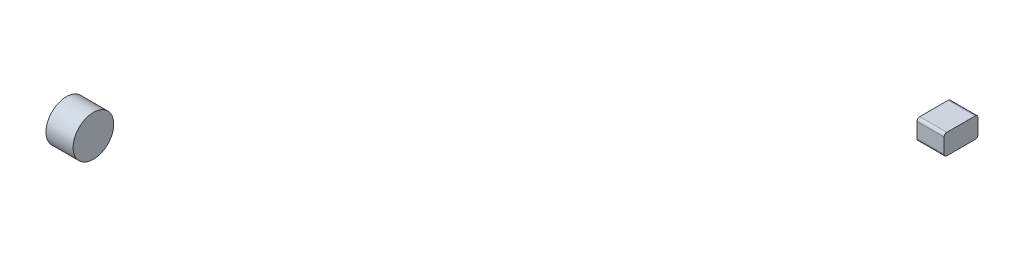
ISO-10303-21;
HEADER;
FILE_DESCRIPTION(('STEP AP214'),'2;1');
FILE_NAME('part.step','',(''),(''),'','','');
FILE_SCHEMA(('AUTOMOTIVE_DESIGN { 1 0 10303 214 1 1 1 1 }'));
ENDSEC;
DATA;
#1=APPLICATION_CONTEXT('core data for automotive mechanical design processes');
#2=APPLICATION_PROTOCOL_DEFINITION('international standard','automotive_design',2000,#1);
#3=PRODUCT_CONTEXT('',#1,'mechanical');
#4=PRODUCT('Part','Part','',(#3));
#5=PRODUCT_RELATED_PRODUCT_CATEGORY('part','',(#4));
#6=PRODUCT_DEFINITION_FORMATION('','',#4);
#7=PRODUCT_DEFINITION_CONTEXT('part definition',#1,'design');
#8=PRODUCT_DEFINITION('design','',#6,#7);
#9=PRODUCT_DEFINITION_SHAPE('','',#8);
#10=(LENGTH_UNIT() NAMED_UNIT(*) SI_UNIT(.MILLI.,.METRE.));
#11=(NAMED_UNIT(*) PLANE_ANGLE_UNIT() SI_UNIT($,.RADIAN.));
#12=(NAMED_UNIT(*) SI_UNIT($,.STERADIAN.) SOLID_ANGLE_UNIT());
#13=UNCERTAINTY_MEASURE_WITH_UNIT(LENGTH_MEASURE(1.E-05),#10,'distance_accuracy_value','');
#14=(GEOMETRIC_REPRESENTATION_CONTEXT(3) GLOBAL_UNCERTAINTY_ASSIGNED_CONTEXT((#13)) GLOBAL_UNIT_ASSIGNED_CONTEXT((#10,
#11,#12)) REPRESENTATION_CONTEXT('',''));
#15=CARTESIAN_POINT('',(0.,0.,0.));
#16=DIRECTION('',(0.,0.,1.));
#17=DIRECTION('',(1.,0.,0.));
#18=AXIS2_PLACEMENT_3D('',#15,#16,#17);
#19=CARTESIAN_POINT('',(66.04,0.698499999999999,1.3335));
#20=DIRECTION('',(-1.,0.,0.));
#21=DIRECTION('',(0.,0.,1.));
#22=AXIS2_PLACEMENT_3D('',#19,#20,#21);
#23=CYLINDRICAL_SURFACE('',#22,0.254);
#24=CARTESIAN_POINT('',(63.5,0.698499999999999,1.3335));
#25=DIRECTION('',(1.,0.,0.));
#26=DIRECTION('',(0.,0.,-1.));
#27=AXIS2_PLACEMENT_3D('',#24,#25,#26);
#28=CIRCLE('',#27,0.254);
#29=CARTESIAN_POINT('',(63.5,0.952499999999999,1.3335));
#30=VERTEX_POINT('',#29);
#31=CARTESIAN_POINT('',(63.5,0.698499999999997,1.5875));
#32=VERTEX_POINT('',#31);
#33=EDGE_CURVE('E135',#30,#32,#28,.T.);
#34=ORIENTED_EDGE('',*,*,#33,.T.);
#35=DIRECTION('',(-1.,0.,0.));
#36=VECTOR('',#35,1.);
#37=CARTESIAN_POINT('',(66.04,0.698499999999997,1.5875));
#38=LINE('',#37,#36);
#39=CARTESIAN_POINT('',(66.04,0.698499999999997,1.5875));
#40=VERTEX_POINT('',#39);
#41=EDGE_CURVE('E12',#40,#32,#38,.T.);
#42=ORIENTED_EDGE('',*,*,#41,.F.);
#43=CARTESIAN_POINT('',(66.04,0.698499999999999,1.3335));
#44=DIRECTION('',(1.,0.,0.));
#45=DIRECTION('',(0.,0.,-1.));
#46=AXIS2_PLACEMENT_3D('',#43,#44,#45);
#47=CIRCLE('',#46,0.254);
#48=CARTESIAN_POINT('',(66.04,0.952499999999999,1.3335));
#49=VERTEX_POINT('',#48);
#50=EDGE_CURVE('E149',#49,#40,#47,.T.);
#51=ORIENTED_EDGE('',*,*,#50,.F.);
#52=DIRECTION('',(-1.,0.,0.));
#53=VECTOR('',#52,1.);
#54=CARTESIAN_POINT('',(66.04,0.952499999999999,1.3335));
#55=LINE('',#54,#53);
#56=EDGE_CURVE('E131',#49,#30,#55,.T.);
#57=ORIENTED_EDGE('',*,*,#56,.T.);
#58=EDGE_LOOP('',(#34,#42,#51,#57));
#59=FACE_BOUND('',#58,.T.);
#60=ADVANCED_FACE('F39',(#59),#23,.T.);
#61=CARTESIAN_POINT('',(66.04,0.698499999999997,1.5875));
#62=DIRECTION('',(0.,0.,-1.));
#63=DIRECTION('',(0.,1.,0.));
#64=AXIS2_PLACEMENT_3D('',#61,#62,#63);
#65=PLANE('',#64);
#66=DIRECTION('',(0.,-1.,0.));
#67=VECTOR('',#66,1.);
#68=CARTESIAN_POINT('',(63.5,0.698499999999997,1.5875));
#69=LINE('',#68,#67);
#70=CARTESIAN_POINT('',(63.5,-0.698499999999999,1.5875));
#71=VERTEX_POINT('',#70);
#72=EDGE_CURVE('E138',#32,#71,#69,.T.);
#73=ORIENTED_EDGE('',*,*,#72,.T.);
#74=DIRECTION('',(-1.,0.,0.));
#75=VECTOR('',#74,1.);
#76=CARTESIAN_POINT('',(66.04,-0.698499999999999,1.5875));
#77=LINE('',#76,#75);
#78=CARTESIAN_POINT('',(66.04,-0.698499999999999,1.5875));
#79=VERTEX_POINT('',#78);
#80=EDGE_CURVE('E47',#79,#71,#77,.T.);
#81=ORIENTED_EDGE('',*,*,#80,.F.);
#82=DIRECTION('',(0.,-1.,0.));
#83=VECTOR('',#82,1.);
#84=CARTESIAN_POINT('',(66.04,0.698499999999997,1.5875));
#85=LINE('',#84,#83);
#86=EDGE_CURVE('E98',#40,#79,#85,.T.);
#87=ORIENTED_EDGE('',*,*,#86,.F.);
#88=ORIENTED_EDGE('',*,*,#41,.T.);
#89=EDGE_LOOP('',(#73,#81,#87,#88));
#90=FACE_BOUND('',#89,.T.);
#91=ADVANCED_FACE('F184',(#90),#65,.F.);
#92=CARTESIAN_POINT('',(66.04,-0.698500000000001,1.3335));
#93=DIRECTION('',(-1.,0.,0.));
#94=DIRECTION('',(0.,0.,1.));
#95=AXIS2_PLACEMENT_3D('',#92,#93,#94);
#96=CYLINDRICAL_SURFACE('',#95,0.254);
#97=CARTESIAN_POINT('',(63.5,-0.698500000000001,1.3335));
#98=DIRECTION('',(1.,0.,0.));
#99=DIRECTION('',(0.,0.,-1.));
#100=AXIS2_PLACEMENT_3D('',#97,#98,#99);
#101=CIRCLE('',#100,0.254);
#102=CARTESIAN_POINT('',(63.5,-0.952500000000001,1.3335));
#103=VERTEX_POINT('',#102);
#104=EDGE_CURVE('E140',#71,#103,#101,.T.);
#105=ORIENTED_EDGE('',*,*,#104,.T.);
#106=DIRECTION('',(-1.,0.,0.));
#107=VECTOR('',#106,1.);
#108=CARTESIAN_POINT('',(66.04,-0.952500000000001,1.3335));
#109=LINE('',#108,#107);
#110=CARTESIAN_POINT('',(66.04,-0.952500000000001,1.3335));
#111=VERTEX_POINT('',#110);
#112=EDGE_CURVE('E156',#111,#103,#109,.T.);
#113=ORIENTED_EDGE('',*,*,#112,.F.);
#114=CARTESIAN_POINT('',(66.04,-0.698500000000001,1.3335));
#115=DIRECTION('',(1.,0.,0.));
#116=DIRECTION('',(0.,0.,-1.));
#117=AXIS2_PLACEMENT_3D('',#114,#115,#116);
#118=CIRCLE('',#117,0.254);
#119=EDGE_CURVE('E164',#79,#111,#118,.T.);
#120=ORIENTED_EDGE('',*,*,#119,.F.);
#121=ORIENTED_EDGE('',*,*,#80,.T.);
#122=EDGE_LOOP('',(#105,#113,#120,#121));
#123=FACE_BOUND('',#122,.T.);
#124=ADVANCED_FACE('F162',(#123),#96,.T.);
#125=CARTESIAN_POINT('',(66.04,-0.952500000000001,1.3335));
#126=DIRECTION('',(0.,1.,0.));
#127=DIRECTION('',(0.,0.,1.));
#128=AXIS2_PLACEMENT_3D('',#125,#126,#127);
#129=PLANE('',#128);
#130=DIRECTION('',(0.,0.,-1.));
#131=VECTOR('',#130,1.);
#132=CARTESIAN_POINT('',(63.5,-0.952500000000001,1.3335));
#133=LINE('',#132,#131);
#134=CARTESIAN_POINT('',(63.5,-0.952500000000001,-1.3335));
#135=VERTEX_POINT('',#134);
#136=EDGE_CURVE('E142',#103,#135,#133,.T.);
#137=ORIENTED_EDGE('',*,*,#136,.T.);
#138=DIRECTION('',(-1.,0.,0.));
#139=VECTOR('',#138,1.);
#140=CARTESIAN_POINT('',(66.04,-0.952500000000001,-1.3335));
#141=LINE('',#140,#139);
#142=CARTESIAN_POINT('',(66.04,-0.952500000000001,-1.3335));
#143=VERTEX_POINT('',#142);
#144=EDGE_CURVE('E153',#143,#135,#141,.T.);
#145=ORIENTED_EDGE('',*,*,#144,.F.);
#146=DIRECTION('',(0.,0.,-1.));
#147=VECTOR('',#146,1.);
#148=CARTESIAN_POINT('',(66.04,-0.952500000000001,1.3335));
#149=LINE('',#148,#147);
#150=EDGE_CURVE('E176',#111,#143,#149,.T.);
#151=ORIENTED_EDGE('',*,*,#150,.F.);
#152=ORIENTED_EDGE('',*,*,#112,.T.);
#153=EDGE_LOOP('',(#137,#145,#151,#152));
#154=FACE_BOUND('',#153,.T.);
#155=ADVANCED_FACE('F172',(#154),#129,.F.);
#156=CARTESIAN_POINT('',(66.04,-0.698500000000001,-1.3335));
#157=DIRECTION('',(-1.,0.,0.));
#158=DIRECTION('',(0.,0.,1.));
#159=AXIS2_PLACEMENT_3D('',#156,#157,#158);
#160=CYLINDRICAL_SURFACE('',#159,0.254);
#161=CARTESIAN_POINT('',(63.5,-0.698500000000001,-1.3335));
#162=DIRECTION('',(1.,0.,0.));
#163=DIRECTION('',(0.,0.,-1.));
#164=AXIS2_PLACEMENT_3D('',#161,#162,#163);
#165=CIRCLE('',#164,0.254);
#166=CARTESIAN_POINT('',(63.5,-0.698499999999999,-1.5875));
#167=VERTEX_POINT('',#166);
#168=EDGE_CURVE('E144',#135,#167,#165,.T.);
#169=ORIENTED_EDGE('',*,*,#168,.T.);
#170=DIRECTION('',(-1.,0.,0.));
#171=VECTOR('',#170,1.);
#172=CARTESIAN_POINT('',(66.04,-0.698499999999999,-1.5875));
#173=LINE('',#172,#171);
#174=CARTESIAN_POINT('',(66.04,-0.698499999999999,-1.5875));
#175=VERTEX_POINT('',#174);
#176=EDGE_CURVE('E126',#175,#167,#173,.T.);
#177=ORIENTED_EDGE('',*,*,#176,.F.);
#178=CARTESIAN_POINT('',(66.04,-0.698500000000001,-1.3335));
#179=DIRECTION('',(1.,0.,0.));
#180=DIRECTION('',(0.,0.,-1.));
#181=AXIS2_PLACEMENT_3D('',#178,#179,#180);
#182=CIRCLE('',#181,0.254);
#183=EDGE_CURVE('E117',#143,#175,#182,.T.);
#184=ORIENTED_EDGE('',*,*,#183,.F.);
#185=ORIENTED_EDGE('',*,*,#144,.T.);
#186=EDGE_LOOP('',(#169,#177,#184,#185));
#187=FACE_BOUND('',#186,.T.);
#188=ADVANCED_FACE('F175',(#187),#160,.T.);
#189=CARTESIAN_POINT('',(66.04,0.698499999999997,-1.5875));
#190=DIRECTION('',(0.,0.,1.));
#191=DIRECTION('',(1.,0.,0.));
#192=AXIS2_PLACEMENT_3D('',#189,#190,#191);
#193=PLANE('',#192);
#194=DIRECTION('',(0.,1.,0.));
#195=VECTOR('',#194,1.);
#196=CARTESIAN_POINT('',(63.5,0.698499999999997,-1.5875));
#197=LINE('',#196,#195);
#198=CARTESIAN_POINT('',(63.5,0.698499999999997,-1.5875));
#199=VERTEX_POINT('',#198);
#200=EDGE_CURVE('E125',#167,#199,#197,.T.);
#201=ORIENTED_EDGE('',*,*,#200,.T.);
#202=DIRECTION('',(-1.,0.,0.));
#203=VECTOR('',#202,1.);
#204=CARTESIAN_POINT('',(66.04,0.698499999999997,-1.5875));
#205=LINE('',#204,#203);
#206=CARTESIAN_POINT('',(66.04,0.698499999999997,-1.5875));
#207=VERTEX_POINT('',#206);
#208=EDGE_CURVE('E122',#207,#199,#205,.T.);
#209=ORIENTED_EDGE('',*,*,#208,.F.);
#210=DIRECTION('',(0.,1.,0.));
#211=VECTOR('',#210,1.);
#212=CARTESIAN_POINT('',(66.04,0.698499999999997,-1.5875));
#213=LINE('',#212,#211);
#214=EDGE_CURVE('E111',#175,#207,#213,.T.);
#215=ORIENTED_EDGE('',*,*,#214,.F.);
#216=ORIENTED_EDGE('',*,*,#176,.T.);
#217=EDGE_LOOP('',(#201,#209,#215,#216));
#218=FACE_BOUND('',#217,.T.);
#219=ADVANCED_FACE('F123',(#218),#193,.F.);
#220=CARTESIAN_POINT('',(66.04,0.698499999999999,-1.3335));
#221=DIRECTION('',(-1.,0.,0.));
#222=DIRECTION('',(0.,0.,1.));
#223=AXIS2_PLACEMENT_3D('',#220,#221,#222);
#224=CYLINDRICAL_SURFACE('',#223,0.254);
#225=CARTESIAN_POINT('',(63.5,0.698499999999999,-1.3335));
#226=DIRECTION('',(1.,0.,0.));
#227=DIRECTION('',(0.,0.,1.));
#228=AXIS2_PLACEMENT_3D('',#225,#226,#227);
#229=CIRCLE('',#228,0.254);
#230=CARTESIAN_POINT('',(63.5,0.952499999999999,-1.3335));
#231=VERTEX_POINT('',#230);
#232=EDGE_CURVE('E84',#199,#231,#229,.T.);
#233=ORIENTED_EDGE('',*,*,#232,.T.);
#234=DIRECTION('',(-1.,0.,0.));
#235=VECTOR('',#234,1.);
#236=CARTESIAN_POINT('',(66.04,0.952499999999999,-1.3335));
#237=LINE('',#236,#235);
#238=CARTESIAN_POINT('',(66.04,0.952499999999999,-1.3335));
#239=VERTEX_POINT('',#238);
#240=EDGE_CURVE('E127',#239,#231,#237,.T.);
#241=ORIENTED_EDGE('',*,*,#240,.F.);
#242=CARTESIAN_POINT('',(66.04,0.698499999999999,-1.3335));
#243=DIRECTION('',(1.,0.,0.));
#244=DIRECTION('',(0.,0.,1.));
#245=AXIS2_PLACEMENT_3D('',#242,#243,#244);
#246=CIRCLE('',#245,0.254);
#247=EDGE_CURVE('E115',#207,#239,#246,.T.);
#248=ORIENTED_EDGE('',*,*,#247,.F.);
#249=ORIENTED_EDGE('',*,*,#208,.T.);
#250=EDGE_LOOP('',(#233,#241,#248,#249));
#251=FACE_BOUND('',#250,.T.);
#252=ADVANCED_FACE('F129',(#251),#224,.T.);
#253=CARTESIAN_POINT('',(66.04,0.952499999999999,1.3335));
#254=DIRECTION('',(0.,-1.,0.));
#255=DIRECTION('',(0.,0.,-1.));
#256=AXIS2_PLACEMENT_3D('',#253,#254,#255);
#257=PLANE('',#256);
#258=DIRECTION('',(0.,0.,1.));
#259=VECTOR('',#258,1.);
#260=CARTESIAN_POINT('',(63.5,0.952499999999999,1.3335));
#261=LINE('',#260,#259);
#262=EDGE_CURVE('E90',#231,#30,#261,.T.);
#263=ORIENTED_EDGE('',*,*,#262,.T.);
#264=ORIENTED_EDGE('',*,*,#56,.F.);
#265=DIRECTION('',(0.,0.,1.));
#266=VECTOR('',#265,1.);
#267=CARTESIAN_POINT('',(66.04,0.952499999999999,1.3335));
#268=LINE('',#267,#266);
#269=EDGE_CURVE('E55',#239,#49,#268,.T.);
#270=ORIENTED_EDGE('',*,*,#269,.F.);
#271=ORIENTED_EDGE('',*,*,#240,.T.);
#272=EDGE_LOOP('',(#263,#264,#270,#271));
#273=FACE_BOUND('',#272,.T.);
#274=ADVANCED_FACE('F200',(#273),#257,.F.);
#275=CARTESIAN_POINT('',(66.04,0.698499999999999,1.3335));
#276=DIRECTION('',(1.,0.,0.));
#277=DIRECTION('',(0.,0.,-1.));
#278=AXIS2_PLACEMENT_3D('',#275,#276,#277);
#279=PLANE('',#278);
#280=ORIENTED_EDGE('',*,*,#50,.T.);
#281=ORIENTED_EDGE('',*,*,#86,.T.);
#282=ORIENTED_EDGE('',*,*,#119,.T.);
#283=ORIENTED_EDGE('',*,*,#150,.T.);
#284=ORIENTED_EDGE('',*,*,#183,.T.);
#285=ORIENTED_EDGE('',*,*,#214,.T.);
#286=ORIENTED_EDGE('',*,*,#247,.T.);
#287=ORIENTED_EDGE('',*,*,#269,.T.);
#288=EDGE_LOOP('',(#280,#281,#282,#283,#284,#285,#286,#287));
#289=FACE_BOUND('',#288,.T.);
#290=ADVANCED_FACE('F113',(#289),#279,.T.);
#291=CARTESIAN_POINT('',(63.5,0.698499999999999,1.3335));
#292=DIRECTION('',(1.,0.,0.));
#293=DIRECTION('',(0.,0.,-1.));
#294=AXIS2_PLACEMENT_3D('',#291,#292,#293);
#295=PLANE('',#294);
#296=ORIENTED_EDGE('',*,*,#33,.F.);
#297=ORIENTED_EDGE('',*,*,#262,.F.);
#298=ORIENTED_EDGE('',*,*,#232,.F.);
#299=ORIENTED_EDGE('',*,*,#200,.F.);
#300=ORIENTED_EDGE('',*,*,#168,.F.);
#301=ORIENTED_EDGE('',*,*,#136,.F.);
#302=ORIENTED_EDGE('',*,*,#104,.F.);
#303=ORIENTED_EDGE('',*,*,#72,.F.);
#304=EDGE_LOOP('',(#296,#297,#298,#299,#300,#301,#302,#303));
#305=FACE_BOUND('',#304,.T.);
#306=ADVANCED_FACE('F168',(#305),#295,.F.);
#307=CLOSED_SHELL('',(#60,#91,#124,#155,#188,#219,#252,#274,#290,#306));
#308=MANIFOLD_SOLID_BREP('B2',#307);
#309=CARTESIAN_POINT('',(-2.54,-25.4,15.24));
#310=DIRECTION('',(1.,0.,0.));
#311=DIRECTION('',(0.,0.,-1.));
#312=AXIS2_PLACEMENT_3D('',#309,#310,#311);
#313=CYLINDRICAL_SURFACE('',#312,1.905);
#314=CARTESIAN_POINT('',(-2.54,-25.4,15.24));
#315=DIRECTION('',(1.,0.,0.));
#316=DIRECTION('',(0.,0.,-1.));
#317=AXIS2_PLACEMENT_3D('',#314,#315,#316);
#318=CIRCLE('',#317,1.905);
#319=CARTESIAN_POINT('',(-2.54,-25.4,13.335));
#320=VERTEX_POINT('',#319);
#321=EDGE_CURVE('E38',#320,#320,#318,.T.);
#322=ORIENTED_EDGE('',*,*,#321,.T.);
#323=EDGE_LOOP('',(#322));
#324=FACE_BOUND('',#323,.T.);
#325=CARTESIAN_POINT('',(0.,-25.4,15.24));
#326=DIRECTION('',(1.,0.,0.));
#327=DIRECTION('',(0.,0.,-1.));
#328=AXIS2_PLACEMENT_3D('',#325,#326,#327);
#329=CIRCLE('',#328,1.905);
#330=CARTESIAN_POINT('',(0.,-25.4,13.335));
#331=VERTEX_POINT('',#330);
#332=EDGE_CURVE('E270',#331,#331,#329,.T.);
#333=ORIENTED_EDGE('',*,*,#332,.F.);
#334=EDGE_LOOP('',(#333));
#335=FACE_BOUND('',#334,.T.);
#336=ADVANCED_FACE('F267',(#324,#335),#313,.T.);
#337=CARTESIAN_POINT('',(-2.54,-25.4,15.24));
#338=DIRECTION('',(1.,0.,0.));
#339=DIRECTION('',(0.,0.,-1.));
#340=AXIS2_PLACEMENT_3D('',#337,#338,#339);
#341=PLANE('',#340);
#342=ORIENTED_EDGE('',*,*,#321,.F.);
#343=EDGE_LOOP('',(#342));
#344=FACE_BOUND('',#343,.T.);
#345=ADVANCED_FACE('F282',(#344),#341,.F.);
#346=CARTESIAN_POINT('',(0.,-25.4,15.24));
#347=DIRECTION('',(1.,0.,0.));
#348=DIRECTION('',(0.,0.,-1.));
#349=AXIS2_PLACEMENT_3D('',#346,#347,#348);
#350=PLANE('',#349);
#351=ORIENTED_EDGE('',*,*,#332,.T.);
#352=EDGE_LOOP('',(#351));
#353=FACE_BOUND('',#352,.T.);
#354=ADVANCED_FACE('F279',(#353),#350,.T.);
#355=CLOSED_SHELL('',(#336,#345,#354));
#356=MANIFOLD_SOLID_BREP('B6',#355);
#357=ADVANCED_BREP_SHAPE_REPRESENTATION('',(#18,#308,#356),#14);
#358=SHAPE_DEFINITION_REPRESENTATION(#9,#357);
ENDSEC;
END-ISO-10303-21;
